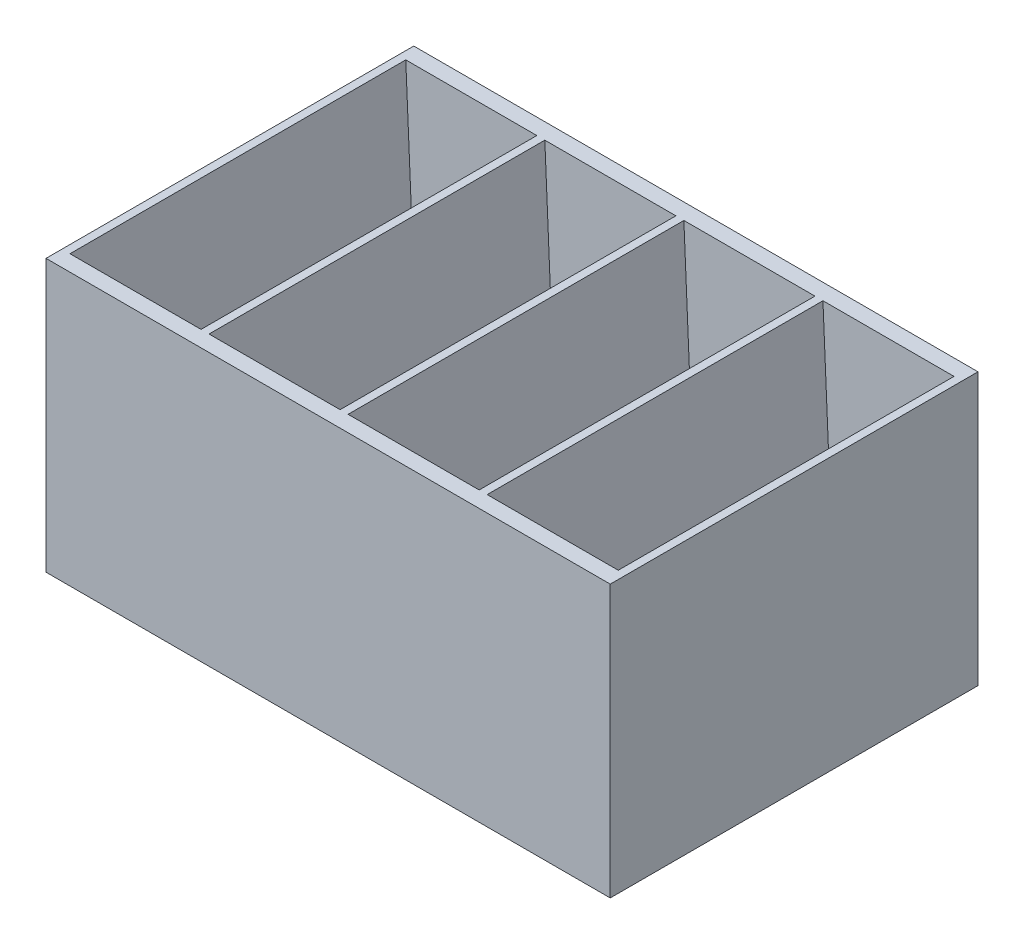
ISO-10303-21;
HEADER;
FILE_DESCRIPTION(('STEP AP214'),'2;1');
FILE_NAME('part.step','',(''),(''),'','','');
FILE_SCHEMA(('AUTOMOTIVE_DESIGN { 1 0 10303 214 1 1 1 1 }'));
ENDSEC;
DATA;
#1=APPLICATION_CONTEXT('core data for automotive mechanical design processes');
#2=APPLICATION_PROTOCOL_DEFINITION('international standard','automotive_design',2000,#1);
#3=PRODUCT_CONTEXT('',#1,'mechanical');
#4=PRODUCT('Part','Part','',(#3));
#5=PRODUCT_RELATED_PRODUCT_CATEGORY('part','',(#4));
#6=PRODUCT_DEFINITION_FORMATION('','',#4);
#7=PRODUCT_DEFINITION_CONTEXT('part definition',#1,'design');
#8=PRODUCT_DEFINITION('design','',#6,#7);
#9=PRODUCT_DEFINITION_SHAPE('','',#8);
#10=(LENGTH_UNIT() NAMED_UNIT(*) SI_UNIT(.MILLI.,.METRE.));
#11=(NAMED_UNIT(*) PLANE_ANGLE_UNIT() SI_UNIT($,.RADIAN.));
#12=(NAMED_UNIT(*) SI_UNIT($,.STERADIAN.) SOLID_ANGLE_UNIT());
#13=UNCERTAINTY_MEASURE_WITH_UNIT(LENGTH_MEASURE(1.E-05),#10,'distance_accuracy_value','');
#14=(GEOMETRIC_REPRESENTATION_CONTEXT(3) GLOBAL_UNCERTAINTY_ASSIGNED_CONTEXT((#13)) GLOBAL_UNIT_ASSIGNED_CONTEXT((#10,
#11,#12)) REPRESENTATION_CONTEXT('',''));
#15=CARTESIAN_POINT('',(0.,0.,0.));
#16=DIRECTION('',(0.,0.,1.));
#17=DIRECTION('',(1.,0.,0.));
#18=AXIS2_PLACEMENT_3D('',#15,#16,#17);
#19=CARTESIAN_POINT('',(216.471662596531,6.35,146.05));
#20=DIRECTION('',(0.999048221581858,-0.0436193873653277,0.));
#21=DIRECTION('',(0.0436193873653277,0.999048221581858,0.));
#22=AXIS2_PLACEMENT_3D('',#19,#20,#21);
#23=PLANE('',#22);
#24=DIRECTION('',(0.0436193873653277,0.999048221581858,0.));
#25=VECTOR('',#24,1.);
#26=CARTESIAN_POINT('',(216.471662596531,6.35,6.35));
#27=LINE('',#26,#25);
#28=CARTESIAN_POINT('',(216.471662596531,6.35,6.34999999999999));
#29=VERTEX_POINT('',#28);
#30=CARTESIAN_POINT('',(220.907614396035,107.95,6.34999999999999));
#31=VERTEX_POINT('',#30);
#32=EDGE_CURVE('E49',#29,#31,#27,.T.);
#33=ORIENTED_EDGE('',*,*,#32,.F.);
#34=DIRECTION('',(0.,0.,-1.));
#35=VECTOR('',#34,1.);
#36=CARTESIAN_POINT('',(216.471662596531,6.35,146.05));
#37=LINE('',#36,#35);
#38=CARTESIAN_POINT('',(216.471662596531,6.35,139.7));
#39=VERTEX_POINT('',#38);
#40=EDGE_CURVE('E199',#39,#29,#37,.T.);
#41=ORIENTED_EDGE('',*,*,#40,.F.);
#42=DIRECTION('',(0.0436193873653277,0.999048221581858,0.));
#43=VECTOR('',#42,1.);
#44=CARTESIAN_POINT('',(216.471662596531,6.35,139.7));
#45=LINE('',#44,#43);
#46=CARTESIAN_POINT('',(220.907614396035,107.95,139.7));
#47=VERTEX_POINT('',#46);
#48=EDGE_CURVE('E316',#39,#47,#45,.T.);
#49=ORIENTED_EDGE('',*,*,#48,.T.);
#50=DIRECTION('',(0.,0.,-1.));
#51=VECTOR('',#50,1.);
#52=CARTESIAN_POINT('',(220.907614396035,107.95,146.05));
#53=LINE('',#52,#51);
#54=EDGE_CURVE('E190',#47,#31,#53,.T.);
#55=ORIENTED_EDGE('',*,*,#54,.T.);
#56=EDGE_LOOP('',(#33,#41,#49,#55));
#57=FACE_BOUND('',#56,.T.);
#58=ADVANCED_FACE('F34',(#57),#23,.F.);
#59=CARTESIAN_POINT('',(173.291662596531,6.35,146.05));
#60=DIRECTION('',(0.,-1.,0.));
#61=DIRECTION('',(0.,0.,-1.));
#62=AXIS2_PLACEMENT_3D('',#59,#60,#61);
#63=PLANE('',#62);
#64=DIRECTION('',(1.,0.,0.));
#65=VECTOR('',#64,1.);
#66=CARTESIAN_POINT('',(173.291662596531,6.35,6.35));
#67=LINE('',#66,#65);
#68=CARTESIAN_POINT('',(173.291662596531,6.35,6.34999999999999));
#69=VERTEX_POINT('',#68);
#70=EDGE_CURVE('E56',#69,#29,#67,.T.);
#71=ORIENTED_EDGE('',*,*,#70,.F.);
#72=DIRECTION('',(0.,0.,-1.));
#73=VECTOR('',#72,1.);
#74=CARTESIAN_POINT('',(173.291662596531,6.35,146.05));
#75=LINE('',#74,#73);
#76=CARTESIAN_POINT('',(173.291662596531,6.35,139.7));
#77=VERTEX_POINT('',#76);
#78=EDGE_CURVE('E196',#77,#69,#75,.T.);
#79=ORIENTED_EDGE('',*,*,#78,.F.);
#80=DIRECTION('',(1.,0.,0.));
#81=VECTOR('',#80,1.);
#82=CARTESIAN_POINT('',(173.291662596531,6.35,139.7));
#83=LINE('',#82,#81);
#84=EDGE_CURVE('E178',#77,#39,#83,.T.);
#85=ORIENTED_EDGE('',*,*,#84,.T.);
#86=ORIENTED_EDGE('',*,*,#40,.T.);
#87=EDGE_LOOP('',(#71,#79,#85,#86));
#88=FACE_BOUND('',#87,.T.);
#89=ADVANCED_FACE('F375',(#88),#63,.F.);
#90=CARTESIAN_POINT('',(168.855710797026,107.95,146.05));
#91=DIRECTION('',(-0.999048221581858,-0.0436193873653373,0.));
#92=DIRECTION('',(0.0436193873653373,-0.999048221581858,0.));
#93=AXIS2_PLACEMENT_3D('',#90,#91,#92);
#94=PLANE('',#93);
#95=DIRECTION('',(0.0436193873653373,-0.999048221581858,0.));
#96=VECTOR('',#95,1.);
#97=CARTESIAN_POINT('',(168.855710797026,107.95,6.35));
#98=LINE('',#97,#96);
#99=CARTESIAN_POINT('',(168.855710797026,107.95,6.34999999999999));
#100=VERTEX_POINT('',#99);
#101=EDGE_CURVE('E195',#100,#69,#98,.T.);
#102=ORIENTED_EDGE('',*,*,#101,.F.);
#103=DIRECTION('',(0.,0.,-1.));
#104=VECTOR('',#103,1.);
#105=CARTESIAN_POINT('',(168.855710797026,107.95,146.05));
#106=LINE('',#105,#104);
#107=CARTESIAN_POINT('',(168.855710797026,107.95,139.7));
#108=VERTEX_POINT('',#107);
#109=EDGE_CURVE('E188',#108,#100,#106,.T.);
#110=ORIENTED_EDGE('',*,*,#109,.F.);
#111=DIRECTION('',(0.0436193873653373,-0.999048221581858,0.));
#112=VECTOR('',#111,1.);
#113=CARTESIAN_POINT('',(168.855710797026,107.95,139.7));
#114=LINE('',#113,#112);
#115=EDGE_CURVE('E172',#108,#77,#114,.T.);
#116=ORIENTED_EDGE('',*,*,#115,.T.);
#117=ORIENTED_EDGE('',*,*,#78,.T.);
#118=EDGE_LOOP('',(#102,#110,#116,#117));
#119=FACE_BOUND('',#118,.T.);
#120=ADVANCED_FACE('F193',(#119),#94,.F.);
#121=CARTESIAN_POINT('',(161.244758997522,6.35,146.05));
#122=DIRECTION('',(0.999048221581858,-0.0436193873653283,0.));
#123=DIRECTION('',(0.0436193873653283,0.999048221581858,0.));
#124=AXIS2_PLACEMENT_3D('',#121,#122,#123);
#125=PLANE('',#124);
#126=DIRECTION('',(0.0436193873653283,0.999048221581858,0.));
#127=VECTOR('',#126,1.);
#128=CARTESIAN_POINT('',(161.244758997522,6.35,6.35));
#129=LINE('',#128,#127);
#130=CARTESIAN_POINT('',(161.244758997522,6.35,6.34999999999999));
#131=VERTEX_POINT('',#130);
#132=CARTESIAN_POINT('',(165.680710797026,107.95,6.34999999999999));
#133=VERTEX_POINT('',#132);
#134=EDGE_CURVE('E283',#131,#133,#129,.T.);
#135=ORIENTED_EDGE('',*,*,#134,.F.);
#136=DIRECTION('',(0.,0.,-1.));
#137=VECTOR('',#136,1.);
#138=CARTESIAN_POINT('',(161.244758997522,6.35,146.05));
#139=LINE('',#138,#137);
#140=CARTESIAN_POINT('',(161.244758997522,6.35,139.7));
#141=VERTEX_POINT('',#140);
#142=EDGE_CURVE('E201',#141,#131,#139,.T.);
#143=ORIENTED_EDGE('',*,*,#142,.F.);
#144=DIRECTION('',(0.0436193873653283,0.999048221581858,0.));
#145=VECTOR('',#144,1.);
#146=CARTESIAN_POINT('',(161.244758997522,6.35,139.7));
#147=LINE('',#146,#145);
#148=CARTESIAN_POINT('',(165.680710797026,107.95,139.7));
#149=VERTEX_POINT('',#148);
#150=EDGE_CURVE('E325',#141,#149,#147,.T.);
#151=ORIENTED_EDGE('',*,*,#150,.T.);
#152=DIRECTION('',(0.,0.,-1.));
#153=VECTOR('',#152,1.);
#154=CARTESIAN_POINT('',(165.680710797026,107.95,146.05));
#155=LINE('',#154,#153);
#156=EDGE_CURVE('E197',#149,#133,#155,.T.);
#157=ORIENTED_EDGE('',*,*,#156,.T.);
#158=EDGE_LOOP('',(#135,#143,#151,#157));
#159=FACE_BOUND('',#158,.T.);
#160=ADVANCED_FACE('F415',(#159),#125,.F.);
#161=CARTESIAN_POINT('',(118.064758997522,6.35,146.05));
#162=DIRECTION('',(0.,-1.,0.));
#163=DIRECTION('',(0.,0.,-1.));
#164=AXIS2_PLACEMENT_3D('',#161,#162,#163);
#165=PLANE('',#164);
#166=DIRECTION('',(1.,0.,0.));
#167=VECTOR('',#166,1.);
#168=CARTESIAN_POINT('',(118.064758997522,6.35,6.35));
#169=LINE('',#168,#167);
#170=CARTESIAN_POINT('',(118.064758997522,6.35,6.34999999999999));
#171=VERTEX_POINT('',#170);
#172=EDGE_CURVE('E274',#171,#131,#169,.T.);
#173=ORIENTED_EDGE('',*,*,#172,.F.);
#174=DIRECTION('',(0.,0.,-1.));
#175=VECTOR('',#174,1.);
#176=CARTESIAN_POINT('',(118.064758997522,6.35,146.05));
#177=LINE('',#176,#175);
#178=CARTESIAN_POINT('',(118.064758997522,6.35,139.7));
#179=VERTEX_POINT('',#178);
#180=EDGE_CURVE('E265',#179,#171,#177,.T.);
#181=ORIENTED_EDGE('',*,*,#180,.F.);
#182=DIRECTION('',(1.,0.,0.));
#183=VECTOR('',#182,1.);
#184=CARTESIAN_POINT('',(118.064758997522,6.35,139.7));
#185=LINE('',#184,#183);
#186=EDGE_CURVE('E275',#179,#141,#185,.T.);
#187=ORIENTED_EDGE('',*,*,#186,.T.);
#188=ORIENTED_EDGE('',*,*,#142,.T.);
#189=EDGE_LOOP('',(#173,#181,#187,#188));
#190=FACE_BOUND('',#189,.T.);
#191=ADVANCED_FACE('F272',(#190),#165,.F.);
#192=CARTESIAN_POINT('',(113.628807198017,107.95,146.05));
#193=DIRECTION('',(-0.999048221581858,-0.0436193873653363,0.));
#194=DIRECTION('',(0.0436193873653363,-0.999048221581858,0.));
#195=AXIS2_PLACEMENT_3D('',#192,#193,#194);
#196=PLANE('',#195);
#197=DIRECTION('',(0.0436193873653363,-0.999048221581858,0.));
#198=VECTOR('',#197,1.);
#199=CARTESIAN_POINT('',(113.628807198017,107.95,6.35));
#200=LINE('',#199,#198);
#201=CARTESIAN_POINT('',(113.628807198017,107.95,6.34999999999999));
#202=VERTEX_POINT('',#201);
#203=EDGE_CURVE('E285',#202,#171,#200,.T.);
#204=ORIENTED_EDGE('',*,*,#203,.F.);
#205=DIRECTION('',(0.,0.,-1.));
#206=VECTOR('',#205,1.);
#207=CARTESIAN_POINT('',(113.628807198017,107.95,146.05));
#208=LINE('',#207,#206);
#209=CARTESIAN_POINT('',(113.628807198017,107.95,139.7));
#210=VERTEX_POINT('',#209);
#211=EDGE_CURVE('E262',#210,#202,#208,.T.);
#212=ORIENTED_EDGE('',*,*,#211,.F.);
#213=DIRECTION('',(0.0436193873653363,-0.999048221581858,0.));
#214=VECTOR('',#213,1.);
#215=CARTESIAN_POINT('',(113.628807198017,107.95,139.7));
#216=LINE('',#215,#214);
#217=EDGE_CURVE('E321',#210,#179,#216,.T.);
#218=ORIENTED_EDGE('',*,*,#217,.T.);
#219=ORIENTED_EDGE('',*,*,#180,.T.);
#220=EDGE_LOOP('',(#204,#212,#218,#219));
#221=FACE_BOUND('',#220,.T.);
#222=ADVANCED_FACE('F408',(#221),#196,.F.);
#223=CARTESIAN_POINT('',(106.017855398513,6.35,146.05));
#224=DIRECTION('',(0.999048221581858,-0.0436193873653286,0.));
#225=DIRECTION('',(0.0436193873653286,0.999048221581858,0.));
#226=AXIS2_PLACEMENT_3D('',#223,#224,#225);
#227=PLANE('',#226);
#228=DIRECTION('',(0.0436193873653286,0.999048221581858,0.));
#229=VECTOR('',#228,1.);
#230=CARTESIAN_POINT('',(106.017855398513,6.35,6.35));
#231=LINE('',#230,#229);
#232=CARTESIAN_POINT('',(106.017855398513,6.35,6.34999999999999));
#233=VERTEX_POINT('',#232);
#234=CARTESIAN_POINT('',(110.453807198017,107.95,6.34999999999999));
#235=VERTEX_POINT('',#234);
#236=EDGE_CURVE('E295',#233,#235,#231,.T.);
#237=ORIENTED_EDGE('',*,*,#236,.F.);
#238=DIRECTION('',(0.,0.,-1.));
#239=VECTOR('',#238,1.);
#240=CARTESIAN_POINT('',(106.017855398513,6.35,146.05));
#241=LINE('',#240,#239);
#242=CARTESIAN_POINT('',(106.017855398513,6.35,139.7));
#243=VERTEX_POINT('',#242);
#244=EDGE_CURVE('E257',#243,#233,#241,.T.);
#245=ORIENTED_EDGE('',*,*,#244,.F.);
#246=DIRECTION('',(0.0436193873653286,0.999048221581858,0.));
#247=VECTOR('',#246,1.);
#248=CARTESIAN_POINT('',(106.017855398513,6.35,139.7));
#249=LINE('',#248,#247);
#250=CARTESIAN_POINT('',(110.453807198017,107.95,139.7));
#251=VERTEX_POINT('',#250);
#252=EDGE_CURVE('E336',#243,#251,#249,.T.);
#253=ORIENTED_EDGE('',*,*,#252,.T.);
#254=DIRECTION('',(0.,0.,-1.));
#255=VECTOR('',#254,1.);
#256=CARTESIAN_POINT('',(110.453807198017,107.95,146.05));
#257=LINE('',#256,#255);
#258=EDGE_CURVE('E260',#251,#235,#257,.T.);
#259=ORIENTED_EDGE('',*,*,#258,.T.);
#260=EDGE_LOOP('',(#237,#245,#253,#259));
#261=FACE_BOUND('',#260,.T.);
#262=ADVANCED_FACE('F401',(#261),#227,.F.);
#263=CARTESIAN_POINT('',(62.837855398513,6.35,146.05));
#264=DIRECTION('',(0.,-1.,0.));
#265=DIRECTION('',(0.,0.,-1.));
#266=AXIS2_PLACEMENT_3D('',#263,#264,#265);
#267=PLANE('',#266);
#268=DIRECTION('',(1.,0.,0.));
#269=VECTOR('',#268,1.);
#270=CARTESIAN_POINT('',(62.837855398513,6.35,6.35));
#271=LINE('',#270,#269);
#272=CARTESIAN_POINT('',(62.837855398513,6.35,6.34999999999999));
#273=VERTEX_POINT('',#272);
#274=EDGE_CURVE('E298',#273,#233,#271,.T.);
#275=ORIENTED_EDGE('',*,*,#274,.F.);
#276=DIRECTION('',(0.,0.,-1.));
#277=VECTOR('',#276,1.);
#278=CARTESIAN_POINT('',(62.837855398513,6.35,146.05));
#279=LINE('',#278,#277);
#280=CARTESIAN_POINT('',(62.837855398513,6.35,139.7));
#281=VERTEX_POINT('',#280);
#282=EDGE_CURVE('E254',#281,#273,#279,.T.);
#283=ORIENTED_EDGE('',*,*,#282,.F.);
#284=DIRECTION('',(1.,0.,0.));
#285=VECTOR('',#284,1.);
#286=CARTESIAN_POINT('',(62.837855398513,6.35,139.7));
#287=LINE('',#286,#285);
#288=EDGE_CURVE('E333',#281,#243,#287,.T.);
#289=ORIENTED_EDGE('',*,*,#288,.T.);
#290=ORIENTED_EDGE('',*,*,#244,.T.);
#291=EDGE_LOOP('',(#275,#283,#289,#290));
#292=FACE_BOUND('',#291,.T.);
#293=ADVANCED_FACE('F395',(#292),#267,.F.);
#294=CARTESIAN_POINT('',(58.4019035990082,107.95,146.05));
#295=DIRECTION('',(-0.999048221581858,-0.0436193873653363,0.));
#296=DIRECTION('',(0.0436193873653363,-0.999048221581858,0.));
#297=AXIS2_PLACEMENT_3D('',#294,#295,#296);
#298=PLANE('',#297);
#299=DIRECTION('',(0.0436193873653362,-0.999048221581858,0.));
#300=VECTOR('',#299,1.);
#301=CARTESIAN_POINT('',(58.4019035990082,107.95,6.35));
#302=LINE('',#301,#300);
#303=CARTESIAN_POINT('',(58.4019035990082,107.95,6.34999999999999));
#304=VERTEX_POINT('',#303);
#305=EDGE_CURVE('E301',#304,#273,#302,.T.);
#306=ORIENTED_EDGE('',*,*,#305,.F.);
#307=DIRECTION('',(0.,0.,-1.));
#308=VECTOR('',#307,1.);
#309=CARTESIAN_POINT('',(58.4019035990082,107.95,146.05));
#310=LINE('',#309,#308);
#311=CARTESIAN_POINT('',(58.4019035990082,107.95,139.7));
#312=VERTEX_POINT('',#311);
#313=EDGE_CURVE('E251',#312,#304,#310,.T.);
#314=ORIENTED_EDGE('',*,*,#313,.F.);
#315=DIRECTION('',(0.0436193873653362,-0.999048221581858,0.));
#316=VECTOR('',#315,1.);
#317=CARTESIAN_POINT('',(58.4019035990082,107.95,139.7));
#318=LINE('',#317,#316);
#319=EDGE_CURVE('E330',#312,#281,#318,.T.);
#320=ORIENTED_EDGE('',*,*,#319,.T.);
#321=ORIENTED_EDGE('',*,*,#282,.T.);
#322=EDGE_LOOP('',(#306,#314,#320,#321));
#323=FACE_BOUND('',#322,.T.);
#324=ADVANCED_FACE('F391',(#323),#298,.F.);
#325=CARTESIAN_POINT('',(224.082614396035,0.,146.05));
#326=DIRECTION('',(0.,1.,0.));
#327=DIRECTION('',(-1.,0.,0.));
#328=AXIS2_PLACEMENT_3D('',#325,#326,#327);
#329=PLANE('',#328);
#330=DIRECTION('',(1.,0.,0.));
#331=VECTOR('',#330,1.);
#332=CARTESIAN_POINT('',(224.082614396035,0.,0.));
#333=LINE('',#332,#331);
#334=CARTESIAN_POINT('',(0.,0.,0.));
#335=VERTEX_POINT('',#334);
#336=CARTESIAN_POINT('',(224.082614396035,0.,0.));
#337=VERTEX_POINT('',#336);
#338=EDGE_CURVE('E224',#335,#337,#333,.T.);
#339=ORIENTED_EDGE('',*,*,#338,.T.);
#340=DIRECTION('',(0.,0.,-1.));
#341=VECTOR('',#340,1.);
#342=CARTESIAN_POINT('',(224.082614396035,0.,146.05));
#343=LINE('',#342,#341);
#344=CARTESIAN_POINT('',(224.082614396035,0.,146.05));
#345=VERTEX_POINT('',#344);
#346=EDGE_CURVE('E11',#345,#337,#343,.T.);
#347=ORIENTED_EDGE('',*,*,#346,.F.);
#348=DIRECTION('',(1.,0.,0.));
#349=VECTOR('',#348,1.);
#350=CARTESIAN_POINT('',(224.082614396035,0.,146.05));
#351=LINE('',#350,#349);
#352=CARTESIAN_POINT('',(0.,0.,146.05));
#353=VERTEX_POINT('',#352);
#354=EDGE_CURVE('E233',#353,#345,#351,.T.);
#355=ORIENTED_EDGE('',*,*,#354,.F.);
#356=DIRECTION('',(0.,0.,-1.));
#357=VECTOR('',#356,1.);
#358=CARTESIAN_POINT('',(0.,0.,146.05));
#359=LINE('',#358,#357);
#360=EDGE_CURVE('E234',#353,#335,#359,.T.);
#361=ORIENTED_EDGE('',*,*,#360,.T.);
#362=EDGE_LOOP('',(#339,#347,#355,#361));
#363=FACE_BOUND('',#362,.T.);
#364=ADVANCED_FACE('F36',(#363),#329,.F.);
#365=CARTESIAN_POINT('',(224.082614396035,107.95,146.05));
#366=DIRECTION('',(-1.,0.,0.));
#367=DIRECTION('',(0.,-1.,0.));
#368=AXIS2_PLACEMENT_3D('',#365,#366,#367);
#369=PLANE('',#368);
#370=DIRECTION('',(0.,1.,0.));
#371=VECTOR('',#370,1.);
#372=CARTESIAN_POINT('',(224.082614396035,107.95,0.));
#373=LINE('',#372,#371);
#374=CARTESIAN_POINT('',(224.082614396035,107.95,0.));
#375=VERTEX_POINT('',#374);
#376=EDGE_CURVE('E219',#337,#375,#373,.T.);
#377=ORIENTED_EDGE('',*,*,#376,.T.);
#378=DIRECTION('',(0.,0.,-1.));
#379=VECTOR('',#378,1.);
#380=CARTESIAN_POINT('',(224.082614396035,107.95,146.05));
#381=LINE('',#380,#379);
#382=CARTESIAN_POINT('',(224.082614396035,107.95,146.05));
#383=VERTEX_POINT('',#382);
#384=EDGE_CURVE('E42',#383,#375,#381,.T.);
#385=ORIENTED_EDGE('',*,*,#384,.F.);
#386=DIRECTION('',(0.,1.,0.));
#387=VECTOR('',#386,1.);
#388=CARTESIAN_POINT('',(224.082614396035,107.95,146.05));
#389=LINE('',#388,#387);
#390=EDGE_CURVE('E217',#345,#383,#389,.T.);
#391=ORIENTED_EDGE('',*,*,#390,.F.);
#392=ORIENTED_EDGE('',*,*,#346,.T.);
#393=EDGE_LOOP('',(#377,#385,#391,#392));
#394=FACE_BOUND('',#393,.T.);
#395=ADVANCED_FACE('F216',(#394),#369,.F.);
#396=CARTESIAN_POINT('',(50.7909517995041,6.35,146.05));
#397=DIRECTION('',(0.999048221581858,-0.0436193873653285,0.));
#398=DIRECTION('',(0.0436193873653285,0.999048221581858,0.));
#399=AXIS2_PLACEMENT_3D('',#396,#397,#398);
#400=PLANE('',#399);
#401=DIRECTION('',(0.,0.,-1.));
#402=VECTOR('',#401,1.);
#403=CARTESIAN_POINT('',(55.2269035990082,107.95,146.05));
#404=LINE('',#403,#402);
#405=CARTESIAN_POINT('',(55.2269035990082,107.95,139.7));
#406=VERTEX_POINT('',#405);
#407=CARTESIAN_POINT('',(55.2269035990082,107.95,6.34999999999999));
#408=VERTEX_POINT('',#407);
#409=EDGE_CURVE('E249',#406,#408,#404,.T.);
#410=ORIENTED_EDGE('',*,*,#409,.T.);
#411=DIRECTION('',(0.0436193873653285,0.999048221581858,0.));
#412=VECTOR('',#411,1.);
#413=CARTESIAN_POINT('',(55.2269035990082,107.95,6.35));
#414=LINE('',#413,#412);
#415=CARTESIAN_POINT('',(50.7909517995041,6.35,6.34999999999999));
#416=VERTEX_POINT('',#415);
#417=EDGE_CURVE('E310',#416,#408,#414,.T.);
#418=ORIENTED_EDGE('',*,*,#417,.F.);
#419=DIRECTION('',(0.,0.,-1.));
#420=VECTOR('',#419,1.);
#421=CARTESIAN_POINT('',(50.7909517995041,6.35,146.05));
#422=LINE('',#421,#420);
#423=CARTESIAN_POINT('',(50.7909517995041,6.35,139.7));
#424=VERTEX_POINT('',#423);
#425=EDGE_CURVE('E246',#424,#416,#422,.T.);
#426=ORIENTED_EDGE('',*,*,#425,.F.);
#427=DIRECTION('',(0.0436193873653285,0.999048221581858,0.));
#428=VECTOR('',#427,1.);
#429=CARTESIAN_POINT('',(55.2269035990082,107.95,139.7));
#430=LINE('',#429,#428);
#431=EDGE_CURVE('E345',#424,#406,#430,.T.);
#432=ORIENTED_EDGE('',*,*,#431,.T.);
#433=EDGE_LOOP('',(#410,#418,#426,#432));
#434=FACE_BOUND('',#433,.T.);
#435=ADVANCED_FACE('F383',(#434),#400,.F.);
#436=CARTESIAN_POINT('',(7.61095179950411,6.34999999999999,146.05));
#437=DIRECTION('',(0.,-1.,0.));
#438=DIRECTION('',(1.,0.,0.));
#439=AXIS2_PLACEMENT_3D('',#436,#437,#438);
#440=PLANE('',#439);
#441=ORIENTED_EDGE('',*,*,#425,.T.);
#442=DIRECTION('',(1.,0.,0.));
#443=VECTOR('',#442,1.);
#444=CARTESIAN_POINT('',(50.7909517995041,6.35,6.35));
#445=LINE('',#444,#443);
#446=CARTESIAN_POINT('',(7.61095179950411,6.34999999999999,6.34999999999999));
#447=VERTEX_POINT('',#446);
#448=EDGE_CURVE('E191',#447,#416,#445,.T.);
#449=ORIENTED_EDGE('',*,*,#448,.F.);
#450=DIRECTION('',(0.,0.,-1.));
#451=VECTOR('',#450,1.);
#452=CARTESIAN_POINT('',(7.61095179950411,6.34999999999999,146.05));
#453=LINE('',#452,#451);
#454=CARTESIAN_POINT('',(7.61095179950411,6.34999999999999,139.7));
#455=VERTEX_POINT('',#454);
#456=EDGE_CURVE('E243',#455,#447,#453,.T.);
#457=ORIENTED_EDGE('',*,*,#456,.F.);
#458=DIRECTION('',(1.,0.,0.));
#459=VECTOR('',#458,1.);
#460=CARTESIAN_POINT('',(50.7909517995041,6.35,139.7));
#461=LINE('',#460,#459);
#462=EDGE_CURVE('E342',#455,#424,#461,.T.);
#463=ORIENTED_EDGE('',*,*,#462,.T.);
#464=EDGE_LOOP('',(#441,#449,#457,#463));
#465=FACE_BOUND('',#464,.T.);
#466=ADVANCED_FACE('F388',(#465),#440,.F.);
#467=CARTESIAN_POINT('',(3.175,107.95,146.05));
#468=DIRECTION('',(-0.999048221581858,-0.043619387365329,0.));
#469=DIRECTION('',(0.043619387365329,-0.999048221581858,0.));
#470=AXIS2_PLACEMENT_3D('',#467,#468,#469);
#471=PLANE('',#470);
#472=ORIENTED_EDGE('',*,*,#456,.T.);
#473=DIRECTION('',(0.043619387365329,-0.999048221581858,0.));
#474=VECTOR('',#473,1.);
#475=CARTESIAN_POINT('',(7.61095179950411,6.34999999999999,6.35));
#476=LINE('',#475,#474);
#477=CARTESIAN_POINT('',(3.175,107.95,6.34999999999999));
#478=VERTEX_POINT('',#477);
#479=EDGE_CURVE('E304',#478,#447,#476,.T.);
#480=ORIENTED_EDGE('',*,*,#479,.F.);
#481=DIRECTION('',(0.,0.,-1.));
#482=VECTOR('',#481,1.);
#483=CARTESIAN_POINT('',(3.175,107.95,146.05));
#484=LINE('',#483,#482);
#485=CARTESIAN_POINT('',(3.175,107.95,139.7));
#486=VERTEX_POINT('',#485);
#487=EDGE_CURVE('E240',#486,#478,#484,.T.);
#488=ORIENTED_EDGE('',*,*,#487,.F.);
#489=DIRECTION('',(0.043619387365329,-0.999048221581858,0.));
#490=VECTOR('',#489,1.);
#491=CARTESIAN_POINT('',(7.61095179950411,6.34999999999999,139.7));
#492=LINE('',#491,#490);
#493=EDGE_CURVE('E339',#486,#455,#492,.T.);
#494=ORIENTED_EDGE('',*,*,#493,.T.);
#495=EDGE_LOOP('',(#472,#480,#488,#494));
#496=FACE_BOUND('',#495,.T.);
#497=ADVANCED_FACE('F525',(#496),#471,.F.);
#498=CARTESIAN_POINT('',(0.,107.95,146.05));
#499=DIRECTION('',(0.,-1.,0.));
#500=DIRECTION('',(0.,0.,-1.));
#501=AXIS2_PLACEMENT_3D('',#498,#499,#500);
#502=PLANE('',#501);
#503=ORIENTED_EDGE('',*,*,#384,.T.);
#504=DIRECTION('',(-1.,0.,0.));
#505=VECTOR('',#504,1.);
#506=CARTESIAN_POINT('',(0.,107.95,0.));
#507=LINE('',#506,#505);
#508=CARTESIAN_POINT('',(0.,107.95,0.));
#509=VERTEX_POINT('',#508);
#510=EDGE_CURVE('E211',#375,#509,#507,.T.);
#511=ORIENTED_EDGE('',*,*,#510,.T.);
#512=DIRECTION('',(0.,0.,-1.));
#513=VECTOR('',#512,1.);
#514=CARTESIAN_POINT('',(0.,107.95,146.05));
#515=LINE('',#514,#513);
#516=CARTESIAN_POINT('',(0.,107.95,146.05));
#517=VERTEX_POINT('',#516);
#518=EDGE_CURVE('E237',#517,#509,#515,.T.);
#519=ORIENTED_EDGE('',*,*,#518,.F.);
#520=DIRECTION('',(-1.,0.,0.));
#521=VECTOR('',#520,1.);
#522=CARTESIAN_POINT('',(220.907614396035,107.95,146.05));
#523=LINE('',#522,#521);
#524=EDGE_CURVE('E213',#383,#517,#523,.T.);
#525=ORIENTED_EDGE('',*,*,#524,.F.);
#526=EDGE_LOOP('',(#503,#511,#519,#525));
#527=FACE_BOUND('',#526,.T.);
#528=ORIENTED_EDGE('',*,*,#109,.T.);
#529=DIRECTION('',(-1.,0.,0.));
#530=VECTOR('',#529,1.);
#531=CARTESIAN_POINT('',(220.907614396035,107.95,6.35));
#532=LINE('',#531,#530);
#533=EDGE_CURVE('E687',#31,#100,#532,.T.);
#534=ORIENTED_EDGE('',*,*,#533,.F.);
#535=ORIENTED_EDGE('',*,*,#54,.F.);
#536=DIRECTION('',(-1.,0.,0.));
#537=VECTOR('',#536,1.);
#538=CARTESIAN_POINT('',(220.907614396035,107.95,139.7));
#539=LINE('',#538,#537);
#540=EDGE_CURVE('E175',#47,#108,#539,.T.);
#541=ORIENTED_EDGE('',*,*,#540,.T.);
#542=EDGE_LOOP('',(#528,#534,#535,#541));
#543=FACE_BOUND('',#542,.T.);
#544=ORIENTED_EDGE('',*,*,#211,.T.);
#545=DIRECTION('',(-1.,0.,0.));
#546=VECTOR('',#545,1.);
#547=CARTESIAN_POINT('',(165.680710797026,107.95,6.35));
#548=LINE('',#547,#546);
#549=EDGE_CURVE('E289',#133,#202,#548,.T.);
#550=ORIENTED_EDGE('',*,*,#549,.F.);
#551=ORIENTED_EDGE('',*,*,#156,.F.);
#552=DIRECTION('',(-1.,0.,0.));
#553=VECTOR('',#552,1.);
#554=CARTESIAN_POINT('',(165.680710797026,107.95,139.7));
#555=LINE('',#554,#553);
#556=EDGE_CURVE('E318',#149,#210,#555,.T.);
#557=ORIENTED_EDGE('',*,*,#556,.T.);
#558=EDGE_LOOP('',(#544,#550,#551,#557));
#559=FACE_BOUND('',#558,.T.);
#560=ORIENTED_EDGE('',*,*,#313,.T.);
#561=DIRECTION('',(-1.,0.,0.));
#562=VECTOR('',#561,1.);
#563=CARTESIAN_POINT('',(110.453807198017,107.95,6.35));
#564=LINE('',#563,#562);
#565=EDGE_CURVE('E287',#235,#304,#564,.T.);
#566=ORIENTED_EDGE('',*,*,#565,.F.);
#567=ORIENTED_EDGE('',*,*,#258,.F.);
#568=DIRECTION('',(-1.,0.,0.));
#569=VECTOR('',#568,1.);
#570=CARTESIAN_POINT('',(110.453807198017,107.95,139.7));
#571=LINE('',#570,#569);
#572=EDGE_CURVE('E327',#251,#312,#571,.T.);
#573=ORIENTED_EDGE('',*,*,#572,.T.);
#574=EDGE_LOOP('',(#560,#566,#567,#573));
#575=FACE_BOUND('',#574,.T.);
#576=ORIENTED_EDGE('',*,*,#487,.T.);
#577=DIRECTION('',(-1.,0.,0.));
#578=VECTOR('',#577,1.);
#579=CARTESIAN_POINT('',(3.175,107.95,6.35));
#580=LINE('',#579,#578);
#581=EDGE_CURVE('E307',#408,#478,#580,.T.);
#582=ORIENTED_EDGE('',*,*,#581,.F.);
#583=ORIENTED_EDGE('',*,*,#409,.F.);
#584=DIRECTION('',(-1.,0.,0.));
#585=VECTOR('',#584,1.);
#586=CARTESIAN_POINT('',(3.175,107.95,139.7));
#587=LINE('',#586,#585);
#588=EDGE_CURVE('E228',#406,#486,#587,.T.);
#589=ORIENTED_EDGE('',*,*,#588,.T.);
#590=EDGE_LOOP('',(#576,#582,#583,#589));
#591=FACE_BOUND('',#590,.T.);
#592=ADVANCED_FACE('F185',(#527,#543,#559,#575,#591),#502,.F.);
#593=CARTESIAN_POINT('',(0.,0.,146.05));
#594=DIRECTION('',(1.,0.,0.));
#595=DIRECTION('',(0.,0.,-1.));
#596=AXIS2_PLACEMENT_3D('',#593,#594,#595);
#597=PLANE('',#596);
#598=DIRECTION('',(0.,-1.,0.));
#599=VECTOR('',#598,1.);
#600=CARTESIAN_POINT('',(0.,0.,0.));
#601=LINE('',#600,#599);
#602=EDGE_CURVE('E226',#509,#335,#601,.T.);
#603=ORIENTED_EDGE('',*,*,#602,.T.);
#604=ORIENTED_EDGE('',*,*,#360,.F.);
#605=DIRECTION('',(0.,-1.,0.));
#606=VECTOR('',#605,1.);
#607=CARTESIAN_POINT('',(0.,0.,146.05));
#608=LINE('',#607,#606);
#609=EDGE_CURVE('E238',#517,#353,#608,.T.);
#610=ORIENTED_EDGE('',*,*,#609,.F.);
#611=ORIENTED_EDGE('',*,*,#518,.T.);
#612=EDGE_LOOP('',(#603,#604,#610,#611));
#613=FACE_BOUND('',#612,.T.);
#614=ADVANCED_FACE('F358',(#613),#597,.F.);
#615=CARTESIAN_POINT('',(0.,0.,146.05));
#616=DIRECTION('',(0.,0.,-1.));
#617=DIRECTION('',(-1.,0.,0.));
#618=AXIS2_PLACEMENT_3D('',#615,#616,#617);
#619=PLANE('',#618);
#620=ORIENTED_EDGE('',*,*,#524,.T.);
#621=ORIENTED_EDGE('',*,*,#609,.T.);
#622=ORIENTED_EDGE('',*,*,#354,.T.);
#623=ORIENTED_EDGE('',*,*,#390,.T.);
#624=EDGE_LOOP('',(#620,#621,#622,#623));
#625=FACE_BOUND('',#624,.T.);
#626=ADVANCED_FACE('F355',(#625),#619,.F.);
#627=CARTESIAN_POINT('',(0.,0.,0.));
#628=DIRECTION('',(0.,0.,-1.));
#629=DIRECTION('',(-1.,0.,0.));
#630=AXIS2_PLACEMENT_3D('',#627,#628,#629);
#631=PLANE('',#630);
#632=ORIENTED_EDGE('',*,*,#510,.F.);
#633=ORIENTED_EDGE('',*,*,#376,.F.);
#634=ORIENTED_EDGE('',*,*,#338,.F.);
#635=ORIENTED_EDGE('',*,*,#602,.F.);
#636=EDGE_LOOP('',(#632,#633,#634,#635));
#637=FACE_BOUND('',#636,.T.);
#638=ADVANCED_FACE('F361',(#637),#631,.T.);
#639=CARTESIAN_POINT('',(0.,0.,139.7));
#640=DIRECTION('',(0.,0.,-1.));
#641=DIRECTION('',(-1.,0.,0.));
#642=AXIS2_PLACEMENT_3D('',#639,#640,#641);
#643=PLANE('',#642);
#644=ORIENTED_EDGE('',*,*,#493,.F.);
#645=ORIENTED_EDGE('',*,*,#588,.F.);
#646=ORIENTED_EDGE('',*,*,#431,.F.);
#647=ORIENTED_EDGE('',*,*,#462,.F.);
#648=EDGE_LOOP('',(#644,#645,#646,#647));
#649=FACE_BOUND('',#648,.T.);
#650=ADVANCED_FACE('F363',(#649),#643,.T.);
#651=CARTESIAN_POINT('',(0.,0.,139.7));
#652=DIRECTION('',(0.,0.,1.));
#653=DIRECTION('',(1.,0.,0.));
#654=AXIS2_PLACEMENT_3D('',#651,#652,#653);
#655=PLANE('',#654);
#656=ORIENTED_EDGE('',*,*,#572,.F.);
#657=ORIENTED_EDGE('',*,*,#252,.F.);
#658=ORIENTED_EDGE('',*,*,#288,.F.);
#659=ORIENTED_EDGE('',*,*,#319,.F.);
#660=EDGE_LOOP('',(#656,#657,#658,#659));
#661=FACE_BOUND('',#660,.T.);
#662=ADVANCED_FACE('F369',(#661),#655,.F.);
#663=CARTESIAN_POINT('',(0.,0.,139.7));
#664=DIRECTION('',(0.,0.,1.));
#665=DIRECTION('',(1.,0.,0.));
#666=AXIS2_PLACEMENT_3D('',#663,#664,#665);
#667=PLANE('',#666);
#668=ORIENTED_EDGE('',*,*,#556,.F.);
#669=ORIENTED_EDGE('',*,*,#150,.F.);
#670=ORIENTED_EDGE('',*,*,#186,.F.);
#671=ORIENTED_EDGE('',*,*,#217,.F.);
#672=EDGE_LOOP('',(#668,#669,#670,#671));
#673=FACE_BOUND('',#672,.T.);
#674=ADVANCED_FACE('F457',(#673),#667,.F.);
#675=CARTESIAN_POINT('',(0.,0.,139.7));
#676=DIRECTION('',(0.,0.,1.));
#677=DIRECTION('',(1.,0.,0.));
#678=AXIS2_PLACEMENT_3D('',#675,#676,#677);
#679=PLANE('',#678);
#680=ORIENTED_EDGE('',*,*,#540,.F.);
#681=ORIENTED_EDGE('',*,*,#48,.F.);
#682=ORIENTED_EDGE('',*,*,#84,.F.);
#683=ORIENTED_EDGE('',*,*,#115,.F.);
#684=EDGE_LOOP('',(#680,#681,#682,#683));
#685=FACE_BOUND('',#684,.T.);
#686=ADVANCED_FACE('F174',(#685),#679,.F.);
#687=CARTESIAN_POINT('',(0.,0.,6.35));
#688=DIRECTION('',(0.,0.,1.));
#689=DIRECTION('',(-1.,0.,0.));
#690=AXIS2_PLACEMENT_3D('',#687,#688,#689);
#691=PLANE('',#690);
#692=ORIENTED_EDGE('',*,*,#479,.T.);
#693=ORIENTED_EDGE('',*,*,#448,.T.);
#694=ORIENTED_EDGE('',*,*,#417,.T.);
#695=ORIENTED_EDGE('',*,*,#581,.T.);
#696=EDGE_LOOP('',(#692,#693,#694,#695));
#697=FACE_BOUND('',#696,.T.);
#698=ADVANCED_FACE('F456',(#697),#691,.T.);
#699=CARTESIAN_POINT('',(0.,0.,6.35));
#700=DIRECTION('',(0.,0.,-1.));
#701=DIRECTION('',(1.,0.,0.));
#702=AXIS2_PLACEMENT_3D('',#699,#700,#701);
#703=PLANE('',#702);
#704=ORIENTED_EDGE('',*,*,#565,.T.);
#705=ORIENTED_EDGE('',*,*,#305,.T.);
#706=ORIENTED_EDGE('',*,*,#274,.T.);
#707=ORIENTED_EDGE('',*,*,#236,.T.);
#708=EDGE_LOOP('',(#704,#705,#706,#707));
#709=FACE_BOUND('',#708,.T.);
#710=ADVANCED_FACE('F640',(#709),#703,.F.);
#711=CARTESIAN_POINT('',(0.,0.,6.35));
#712=DIRECTION('',(0.,0.,-1.));
#713=DIRECTION('',(1.,0.,0.));
#714=AXIS2_PLACEMENT_3D('',#711,#712,#713);
#715=PLANE('',#714);
#716=ORIENTED_EDGE('',*,*,#549,.T.);
#717=ORIENTED_EDGE('',*,*,#203,.T.);
#718=ORIENTED_EDGE('',*,*,#172,.T.);
#719=ORIENTED_EDGE('',*,*,#134,.T.);
#720=EDGE_LOOP('',(#716,#717,#718,#719));
#721=FACE_BOUND('',#720,.T.);
#722=ADVANCED_FACE('F282',(#721),#715,.F.);
#723=CARTESIAN_POINT('',(0.,0.,6.35));
#724=DIRECTION('',(0.,0.,-1.));
#725=DIRECTION('',(1.,0.,0.));
#726=AXIS2_PLACEMENT_3D('',#723,#724,#725);
#727=PLANE('',#726);
#728=ORIENTED_EDGE('',*,*,#533,.T.);
#729=ORIENTED_EDGE('',*,*,#101,.T.);
#730=ORIENTED_EDGE('',*,*,#70,.T.);
#731=ORIENTED_EDGE('',*,*,#32,.T.);
#732=EDGE_LOOP('',(#728,#729,#730,#731));
#733=FACE_BOUND('',#732,.T.);
#734=ADVANCED_FACE('F626',(#733),#727,.F.);
#735=CLOSED_SHELL('',(#58,#89,#120,#160,#191,#222,#262,#293,#324,#364,#395,#435,#466,#497,#592,
#614,#626,#638,#650,#662,#674,#686,#698,#710,#722,#734));
#736=MANIFOLD_SOLID_BREP('B2',#735);
#737=ADVANCED_BREP_SHAPE_REPRESENTATION('',(#18,#736),#14);
#738=SHAPE_DEFINITION_REPRESENTATION(#9,#737);
ENDSEC;
END-ISO-10303-21;
